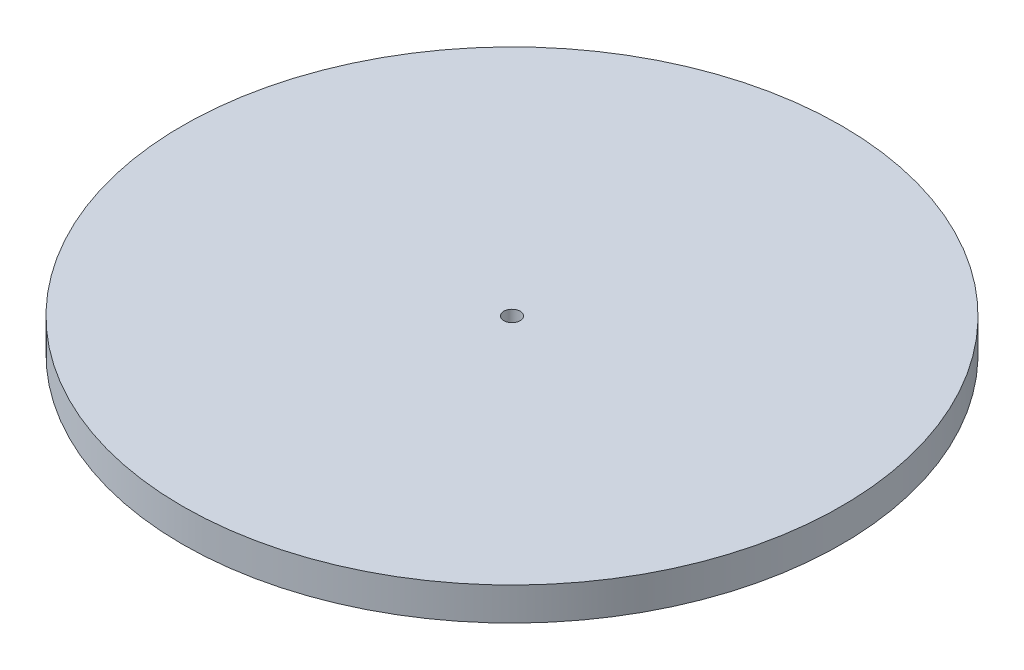
ISO-10303-21;
HEADER;
FILE_DESCRIPTION(('STEP AP214'),'2;1');
FILE_NAME('part.step','',(''),(''),'','','');
FILE_SCHEMA(('AUTOMOTIVE_DESIGN { 1 0 10303 214 1 1 1 1 }'));
ENDSEC;
DATA;
#1=APPLICATION_CONTEXT('core data for automotive mechanical design processes');
#2=APPLICATION_PROTOCOL_DEFINITION('international standard','automotive_design',2000,#1);
#3=PRODUCT_CONTEXT('',#1,'mechanical');
#4=PRODUCT('Part','Part','',(#3));
#5=PRODUCT_RELATED_PRODUCT_CATEGORY('part','',(#4));
#6=PRODUCT_DEFINITION_FORMATION('','',#4);
#7=PRODUCT_DEFINITION_CONTEXT('part definition',#1,'design');
#8=PRODUCT_DEFINITION('design','',#6,#7);
#9=PRODUCT_DEFINITION_SHAPE('','',#8);
#10=(LENGTH_UNIT() NAMED_UNIT(*) SI_UNIT(.MILLI.,.METRE.));
#11=(NAMED_UNIT(*) PLANE_ANGLE_UNIT() SI_UNIT($,.RADIAN.));
#12=(NAMED_UNIT(*) SI_UNIT($,.STERADIAN.) SOLID_ANGLE_UNIT());
#13=UNCERTAINTY_MEASURE_WITH_UNIT(LENGTH_MEASURE(1.E-05),#10,'distance_accuracy_value','');
#14=(GEOMETRIC_REPRESENTATION_CONTEXT(3) GLOBAL_UNCERTAINTY_ASSIGNED_CONTEXT((#13)) GLOBAL_UNIT_ASSIGNED_CONTEXT((#10,
#11,#12)) REPRESENTATION_CONTEXT('',''));
#15=CARTESIAN_POINT('',(0.,0.,0.));
#16=DIRECTION('',(0.,0.,1.));
#17=DIRECTION('',(1.,0.,0.));
#18=AXIS2_PLACEMENT_3D('',#15,#16,#17);
#19=CARTESIAN_POINT('',(0.,20.,0.));
#20=DIRECTION('',(0.,1.,0.));
#21=DIRECTION('',(0.,0.,1.));
#22=AXIS2_PLACEMENT_3D('',#19,#20,#21);
#23=PLANE('',#22);
#24=CARTESIAN_POINT('',(0.,20.,0.));
#25=DIRECTION('',(0.,1.,0.));
#26=DIRECTION('',(0.,0.,1.));
#27=AXIS2_PLACEMENT_3D('',#24,#25,#26);
#28=CIRCLE('',#27,200.);
#29=CARTESIAN_POINT('',(0.,20.,200.));
#30=VERTEX_POINT('',#29);
#31=EDGE_CURVE('E10',#30,#30,#28,.T.);
#32=ORIENTED_EDGE('',*,*,#31,.T.);
#33=EDGE_LOOP('',(#32));
#34=FACE_BOUND('',#33,.T.);
#35=CARTESIAN_POINT('',(0.,20.,0.));
#36=DIRECTION('',(0.,1.,0.));
#37=DIRECTION('',(0.,0.,1.));
#38=AXIS2_PLACEMENT_3D('',#35,#36,#37);
#39=CIRCLE('',#38,5.);
#40=CARTESIAN_POINT('',(0.,20.,5.));
#41=VERTEX_POINT('',#40);
#42=EDGE_CURVE('E42',#41,#41,#39,.T.);
#43=ORIENTED_EDGE('',*,*,#42,.F.);
#44=EDGE_LOOP('',(#43));
#45=FACE_BOUND('',#44,.T.);
#46=ADVANCED_FACE('F31',(#34,#45),#23,.T.);
#47=CARTESIAN_POINT('',(0.,0.,0.));
#48=DIRECTION('',(0.,1.,0.));
#49=DIRECTION('',(0.,0.,1.));
#50=AXIS2_PLACEMENT_3D('',#47,#48,#49);
#51=PLANE('',#50);
#52=CARTESIAN_POINT('',(0.,0.,0.));
#53=DIRECTION('',(0.,1.,0.));
#54=DIRECTION('',(0.,0.,1.));
#55=AXIS2_PLACEMENT_3D('',#52,#53,#54);
#56=CIRCLE('',#55,200.);
#57=CARTESIAN_POINT('',(0.,0.,200.));
#58=VERTEX_POINT('',#57);
#59=EDGE_CURVE('E35',#58,#58,#56,.T.);
#60=ORIENTED_EDGE('',*,*,#59,.F.);
#61=EDGE_LOOP('',(#60));
#62=FACE_BOUND('',#61,.T.);
#63=CARTESIAN_POINT('',(0.,0.,0.));
#64=DIRECTION('',(0.,1.,0.));
#65=DIRECTION('',(0.,0.,1.));
#66=AXIS2_PLACEMENT_3D('',#63,#64,#65);
#67=CIRCLE('',#66,5.);
#68=CARTESIAN_POINT('',(0.,0.,5.));
#69=VERTEX_POINT('',#68);
#70=EDGE_CURVE('E44',#69,#69,#67,.T.);
#71=ORIENTED_EDGE('',*,*,#70,.T.);
#72=EDGE_LOOP('',(#71));
#73=FACE_BOUND('',#72,.T.);
#74=ADVANCED_FACE('F54',(#62,#73),#51,.F.);
#75=CARTESIAN_POINT('',(0.,20.,0.));
#76=DIRECTION('',(0.,-1.,0.));
#77=DIRECTION('',(0.,0.,-1.));
#78=AXIS2_PLACEMENT_3D('',#75,#76,#77);
#79=CYLINDRICAL_SURFACE('',#78,200.);
#80=ORIENTED_EDGE('',*,*,#31,.F.);
#81=EDGE_LOOP('',(#80));
#82=FACE_BOUND('',#81,.T.);
#83=ORIENTED_EDGE('',*,*,#59,.T.);
#84=EDGE_LOOP('',(#83));
#85=FACE_BOUND('',#84,.T.);
#86=ADVANCED_FACE('F33',(#82,#85),#79,.T.);
#87=CARTESIAN_POINT('',(0.,20.,0.));
#88=DIRECTION('',(0.,-1.,0.));
#89=DIRECTION('',(0.,0.,-1.));
#90=AXIS2_PLACEMENT_3D('',#87,#88,#89);
#91=CYLINDRICAL_SURFACE('',#90,5.);
#92=ORIENTED_EDGE('',*,*,#42,.T.);
#93=EDGE_LOOP('',(#92));
#94=FACE_BOUND('',#93,.T.);
#95=ORIENTED_EDGE('',*,*,#70,.F.);
#96=EDGE_LOOP('',(#95));
#97=FACE_BOUND('',#96,.T.);
#98=ADVANCED_FACE('F50',(#94,#97),#91,.F.);
#99=CLOSED_SHELL('',(#46,#74,#86,#98));
#100=MANIFOLD_SOLID_BREP('B2',#99);
#101=ADVANCED_BREP_SHAPE_REPRESENTATION('',(#18,#100),#14);
#102=SHAPE_DEFINITION_REPRESENTATION(#9,#101);
ENDSEC;
END-ISO-10303-21;
